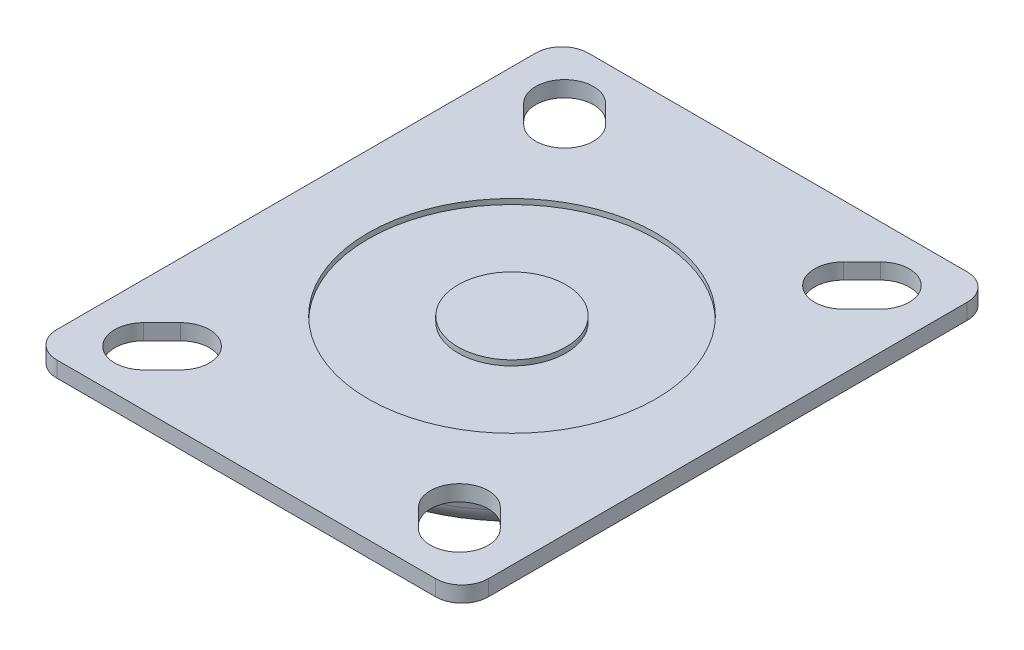
ISO-10303-21;
HEADER;
FILE_DESCRIPTION(('STEP AP214'),'2;1');
FILE_NAME('part.step','',(''),(''),'','','');
FILE_SCHEMA(('AUTOMOTIVE_DESIGN { 1 0 10303 214 1 1 1 1 }'));
ENDSEC;
DATA;
#1=APPLICATION_CONTEXT('core data for automotive mechanical design processes');
#2=APPLICATION_PROTOCOL_DEFINITION('international standard','automotive_design',2000,#1);
#3=PRODUCT_CONTEXT('',#1,'mechanical');
#4=PRODUCT('Part','Part','',(#3));
#5=PRODUCT_RELATED_PRODUCT_CATEGORY('part','',(#4));
#6=PRODUCT_DEFINITION_FORMATION('','',#4);
#7=PRODUCT_DEFINITION_CONTEXT('part definition',#1,'design');
#8=PRODUCT_DEFINITION('design','',#6,#7);
#9=PRODUCT_DEFINITION_SHAPE('','',#8);
#10=(LENGTH_UNIT() NAMED_UNIT(*) SI_UNIT(.MILLI.,.METRE.));
#11=(NAMED_UNIT(*) PLANE_ANGLE_UNIT() SI_UNIT($,.RADIAN.));
#12=(NAMED_UNIT(*) SI_UNIT($,.STERADIAN.) SOLID_ANGLE_UNIT());
#13=UNCERTAINTY_MEASURE_WITH_UNIT(LENGTH_MEASURE(1.E-05),#10,'distance_accuracy_value','');
#14=(GEOMETRIC_REPRESENTATION_CONTEXT(3) GLOBAL_UNCERTAINTY_ASSIGNED_CONTEXT((#13)) GLOBAL_UNIT_ASSIGNED_CONTEXT((#10,
#11,#12)) REPRESENTATION_CONTEXT('',''));
#15=CARTESIAN_POINT('',(0.,0.,0.));
#16=DIRECTION('',(0.,0.,1.));
#17=DIRECTION('',(1.,0.,0.));
#18=AXIS2_PLACEMENT_3D('',#15,#16,#17);
#19=CARTESIAN_POINT('',(0.,60.5,-62.8045018441136));
#20=DIRECTION('',(0.,1.,0.));
#21=DIRECTION('',(0.,0.,1.));
#22=AXIS2_PLACEMENT_3D('',#19,#20,#21);
#23=PLANE('',#22);
#24=CARTESIAN_POINT('',(0.,60.5,-35.));
#25=DIRECTION('',(0.,-1.,0.));
#26=DIRECTION('',(0.,0.,-1.));
#27=AXIS2_PLACEMENT_3D('',#24,#25,#26);
#28=CIRCLE('',#27,27.8045018441136);
#29=CARTESIAN_POINT('',(0.,60.5,-62.8045018441136));
#30=VERTEX_POINT('',#29);
#31=EDGE_CURVE('E21',#30,#30,#28,.F.);
#32=ORIENTED_EDGE('',*,*,#31,.F.);
#33=EDGE_LOOP('',(#32));
#34=FACE_BOUND('',#33,.T.);
#35=ADVANCED_FACE('F17',(#34),#23,.F.);
#36=CARTESIAN_POINT('',(0.,65.5,-35.));
#37=DIRECTION('',(0.,-1.,0.));
#38=DIRECTION('',(0.,0.,-1.));
#39=AXIS2_PLACEMENT_3D('',#36,#37,#38);
#40=TOROIDAL_SURFACE('',#39,27.8045018441136,5.);
#41=CARTESIAN_POINT('',(0.,64.6317591116653,-35.));
#42=DIRECTION('',(0.,1.,0.));
#43=DIRECTION('',(0.,0.,1.));
#44=AXIS2_PLACEMENT_3D('',#41,#42,#43);
#45=CIRCLE('',#44,32.7285406091746);
#46=CARTESIAN_POINT('',(0.,64.6317591116653,-2.27145939082539));
#47=VERTEX_POINT('',#46);
#48=EDGE_CURVE('E221',#47,#47,#45,.T.);
#49=ORIENTED_EDGE('',*,*,#48,.F.);
#50=EDGE_LOOP('',(#49));
#51=FACE_BOUND('',#50,.T.);
#52=ORIENTED_EDGE('',*,*,#31,.T.);
#53=EDGE_LOOP('',(#52));
#54=FACE_BOUND('',#53,.T.);
#55=ADVANCED_FACE('F19',(#51,#54),#40,.T.);
#56=CARTESIAN_POINT('',(-36.,73.5,-80.5));
#57=DIRECTION('',(0.,1.,0.));
#58=DIRECTION('',(0.,0.,1.));
#59=AXIS2_PLACEMENT_3D('',#56,#57,#58);
#60=PLANE('',#59);
#61=CARTESIAN_POINT('',(0.,73.5,-35.));
#62=DIRECTION('',(0.,-1.,0.));
#63=DIRECTION('',(0.,0.,-1.));
#64=AXIS2_PLACEMENT_3D('',#61,#62,#63);
#65=CIRCLE('',#64,10.25);
#66=CARTESIAN_POINT('',(0.,73.5,-45.25));
#67=VERTEX_POINT('',#66);
#68=EDGE_CURVE('E223',#67,#67,#65,.T.);
#69=ORIENTED_EDGE('',*,*,#68,.F.);
#70=EDGE_LOOP('',(#69));
#71=FACE_BOUND('',#70,.T.);
#72=ADVANCED_FACE('F318',(#71),#60,.T.);
#73=CARTESIAN_POINT('',(0.,70.5,-35.));
#74=DIRECTION('',(0.,1.,0.));
#75=DIRECTION('',(0.,0.,1.));
#76=AXIS2_PLACEMENT_3D('',#73,#74,#75);
#77=CONICAL_SURFACE('',#76,33.7632698070847,0.174532925199442);
#78=ORIENTED_EDGE('',*,*,#48,.T.);
#79=EDGE_LOOP('',(#78));
#80=FACE_BOUND('',#79,.T.);
#81=CARTESIAN_POINT('',(0.,70.5,-35.));
#82=DIRECTION('',(0.,1.,0.));
#83=DIRECTION('',(0.,0.,1.));
#84=AXIS2_PLACEMENT_3D('',#81,#82,#83);
#85=CIRCLE('',#84,33.7632698070847);
#86=CARTESIAN_POINT('',(0.,70.5,-1.23673019291531));
#87=VERTEX_POINT('',#86);
#88=EDGE_CURVE('E310',#87,#87,#85,.F.);
#89=ORIENTED_EDGE('',*,*,#88,.T.);
#90=EDGE_LOOP('',(#89));
#91=FACE_BOUND('',#90,.T.);
#92=ADVANCED_FACE('F320',(#80,#91),#77,.T.);
#93=CARTESIAN_POINT('',(0.,72.5,-35.));
#94=DIRECTION('',(0.,-1.,0.));
#95=DIRECTION('',(0.,0.,-1.));
#96=AXIS2_PLACEMENT_3D('',#93,#94,#95);
#97=CYLINDRICAL_SURFACE('',#96,10.25);
#98=ORIENTED_EDGE('',*,*,#68,.T.);
#99=EDGE_LOOP('',(#98));
#100=FACE_BOUND('',#99,.T.);
#101=CARTESIAN_POINT('',(0.,72.5,-35.));
#102=DIRECTION('',(0.,-1.,0.));
#103=DIRECTION('',(0.,0.,-1.));
#104=AXIS2_PLACEMENT_3D('',#101,#102,#103);
#105=CIRCLE('',#104,10.25);
#106=CARTESIAN_POINT('',(0.,72.5,-45.25));
#107=VERTEX_POINT('',#106);
#108=EDGE_CURVE('E186',#107,#107,#105,.T.);
#109=ORIENTED_EDGE('',*,*,#108,.F.);
#110=EDGE_LOOP('',(#109));
#111=FACE_BOUND('',#110,.T.);
#112=ADVANCED_FACE('F315',(#100,#111),#97,.T.);
#113=CARTESIAN_POINT('',(-36.,70.5,-80.5));
#114=DIRECTION('',(0.,1.,0.));
#115=DIRECTION('',(0.,0.,1.));
#116=AXIS2_PLACEMENT_3D('',#113,#114,#115);
#117=PLANE('',#116);
#118=ORIENTED_EDGE('',*,*,#88,.F.);
#119=EDGE_LOOP('',(#118));
#120=FACE_BOUND('',#119,.T.);
#121=DIRECTION('',(0.707106781186547,0.,-0.707106781186548));
#122=VECTOR('',#121,1.);
#123=CARTESIAN_POINT('',(-26.110912703474,70.5,8.88908729652604));
#124=LINE('',#123,#122);
#125=CARTESIAN_POINT('',(-26.110912703474,70.5,8.88908729652602));
#126=VERTEX_POINT('',#125);
#127=CARTESIAN_POINT('',(-22.610912703474,70.5,5.38908729652605));
#128=VERTEX_POINT('',#127);
#129=EDGE_CURVE('E276',#126,#128,#124,.T.);
#130=ORIENTED_EDGE('',*,*,#129,.T.);
#131=CARTESIAN_POINT('',(-26.5,70.5,1.50000000000003));
#132=DIRECTION('',(0.,-1.,0.));
#133=DIRECTION('',(0.,0.,-1.));
#134=AXIS2_PLACEMENT_3D('',#131,#132,#133);
#135=CIRCLE('',#134,5.50000000000004);
#136=CARTESIAN_POINT('',(-30.389087296526,70.5,-2.38908729652601));
#137=VERTEX_POINT('',#136);
#138=EDGE_CURVE('E270',#128,#137,#135,.F.);
#139=ORIENTED_EDGE('',*,*,#138,.T.);
#140=DIRECTION('',(-0.707106781186547,0.,0.707106781186548));
#141=VECTOR('',#140,1.);
#142=CARTESIAN_POINT('',(-30.389087296526,70.5,-2.38908729652604));
#143=LINE('',#142,#141);
#144=CARTESIAN_POINT('',(-33.889087296526,70.5,1.11091270347397));
#145=VERTEX_POINT('',#144);
#146=EDGE_CURVE('E690',#137,#145,#143,.T.);
#147=ORIENTED_EDGE('',*,*,#146,.T.);
#148=CARTESIAN_POINT('',(-30.,70.5,4.99999999999997));
#149=DIRECTION('',(0.,-1.,0.));
#150=DIRECTION('',(0.,0.,-1.));
#151=AXIS2_PLACEMENT_3D('',#148,#149,#150);
#152=CIRCLE('',#151,5.50000000000005);
#153=EDGE_CURVE('E273',#145,#126,#152,.F.);
#154=ORIENTED_EDGE('',*,*,#153,.T.);
#155=EDGE_LOOP('',(#130,#139,#147,#154));
#156=FACE_BOUND('',#155,.T.);
#157=CARTESIAN_POINT('',(-30.,70.5,-75.));
#158=DIRECTION('',(0.,-1.,0.));
#159=DIRECTION('',(0.,0.,-1.));
#160=AXIS2_PLACEMENT_3D('',#157,#158,#159);
#161=CIRCLE('',#160,5.50000000000001);
#162=CARTESIAN_POINT('',(-26.110912703474,70.5,-78.889087296526));
#163=VERTEX_POINT('',#162);
#164=CARTESIAN_POINT('',(-33.889087296526,70.5,-71.110912703474));
#165=VERTEX_POINT('',#164);
#166=EDGE_CURVE('E281',#163,#165,#161,.F.);
#167=ORIENTED_EDGE('',*,*,#166,.T.);
#168=DIRECTION('',(0.707106781186548,0.,0.707106781186547));
#169=VECTOR('',#168,1.);
#170=CARTESIAN_POINT('',(-33.889087296526,70.5,-71.110912703474));
#171=LINE('',#170,#169);
#172=CARTESIAN_POINT('',(-30.389087296526,70.5,-67.610912703474));
#173=VERTEX_POINT('',#172);
#174=EDGE_CURVE('E695',#165,#173,#171,.T.);
#175=ORIENTED_EDGE('',*,*,#174,.T.);
#176=CARTESIAN_POINT('',(-26.5,70.5,-71.5));
#177=DIRECTION('',(0.,-1.,0.));
#178=DIRECTION('',(0.,0.,-1.));
#179=AXIS2_PLACEMENT_3D('',#176,#177,#178);
#180=CIRCLE('',#179,5.50000000000001);
#181=CARTESIAN_POINT('',(-22.610912703474,70.5,-75.389087296526));
#182=VERTEX_POINT('',#181);
#183=EDGE_CURVE('E277',#173,#182,#180,.F.);
#184=ORIENTED_EDGE('',*,*,#183,.T.);
#185=DIRECTION('',(-0.707106781186548,0.,-0.707106781186548));
#186=VECTOR('',#185,1.);
#187=CARTESIAN_POINT('',(-22.610912703474,70.5,-75.389087296526));
#188=LINE('',#187,#186);
#189=EDGE_CURVE('E283',#182,#163,#188,.T.);
#190=ORIENTED_EDGE('',*,*,#189,.T.);
#191=EDGE_LOOP('',(#167,#175,#184,#190));
#192=FACE_BOUND('',#191,.T.);
#193=CARTESIAN_POINT('',(26.4999993552772,70.5,1.49999935527719));
#194=DIRECTION('',(0.,-1.,0.));
#195=DIRECTION('',(0.,0.,-1.));
#196=AXIS2_PLACEMENT_3D('',#193,#194,#195);
#197=CIRCLE('',#196,5.5);
#198=CARTESIAN_POINT('',(30.3890868129839,70.5,-2.38908778006808));
#199=VERTEX_POINT('',#198);
#200=CARTESIAN_POINT('',(22.6109122199319,70.5,5.38908681298387));
#201=VERTEX_POINT('',#200);
#202=EDGE_CURVE('E289',#199,#201,#197,.F.);
#203=ORIENTED_EDGE('',*,*,#202,.T.);
#204=DIRECTION('',(0.707106781186547,0.,0.707106781186548));
#205=VECTOR('',#204,1.);
#206=CARTESIAN_POINT('',(22.610912703474,70.5,5.38908729652596));
#207=LINE('',#206,#205);
#208=CARTESIAN_POINT('',(26.1109122199319,70.5,8.88908681298388));
#209=VERTEX_POINT('',#208);
#210=EDGE_CURVE('E295',#201,#209,#207,.T.);
#211=ORIENTED_EDGE('',*,*,#210,.T.);
#212=CARTESIAN_POINT('',(29.9999993552772,70.5,4.99999935527719));
#213=DIRECTION('',(0.,-1.,0.));
#214=DIRECTION('',(0.,0.,-1.));
#215=AXIS2_PLACEMENT_3D('',#212,#213,#214);
#216=CIRCLE('',#215,5.5);
#217=CARTESIAN_POINT('',(33.8890868129839,70.5,1.11091221993192));
#218=VERTEX_POINT('',#217);
#219=EDGE_CURVE('E285',#209,#218,#216,.F.);
#220=ORIENTED_EDGE('',*,*,#219,.T.);
#221=DIRECTION('',(-0.707106781186547,0.,-0.707106781186548));
#222=VECTOR('',#221,1.);
#223=CARTESIAN_POINT('',(33.889087296526,70.5,1.11091270347404));
#224=LINE('',#223,#222);
#225=EDGE_CURVE('E291',#218,#199,#224,.T.);
#226=ORIENTED_EDGE('',*,*,#225,.T.);
#227=EDGE_LOOP('',(#203,#211,#220,#226));
#228=FACE_BOUND('',#227,.T.);
#229=DIRECTION('',(0.707106781186548,0.,-0.707106781186547));
#230=VECTOR('',#229,1.);
#231=CARTESIAN_POINT('',(30.389087296526,70.5,-67.610912703474));
#232=LINE('',#231,#230);
#233=CARTESIAN_POINT('',(30.389087296526,70.5,-67.610912703474));
#234=VERTEX_POINT('',#233);
#235=CARTESIAN_POINT('',(33.889087296526,70.5,-71.110912703474));
#236=VERTEX_POINT('',#235);
#237=EDGE_CURVE('E300',#234,#236,#232,.T.);
#238=ORIENTED_EDGE('',*,*,#237,.T.);
#239=CARTESIAN_POINT('',(30.,70.5,-75.));
#240=DIRECTION('',(0.,-1.,0.));
#241=DIRECTION('',(0.,0.,-1.));
#242=AXIS2_PLACEMENT_3D('',#239,#240,#241);
#243=CIRCLE('',#242,5.49999999999996);
#244=CARTESIAN_POINT('',(26.110912703474,70.5,-78.889087296526));
#245=VERTEX_POINT('',#244);
#246=EDGE_CURVE('E293',#236,#245,#243,.F.);
#247=ORIENTED_EDGE('',*,*,#246,.T.);
#248=DIRECTION('',(-0.707106781186549,0.,0.707106781186546));
#249=VECTOR('',#248,1.);
#250=CARTESIAN_POINT('',(26.110912703474,70.5,-78.889087296526));
#251=LINE('',#250,#249);
#252=CARTESIAN_POINT('',(22.610912703474,70.5,-75.389087296526));
#253=VERTEX_POINT('',#252);
#254=EDGE_CURVE('E207',#245,#253,#251,.T.);
#255=ORIENTED_EDGE('',*,*,#254,.T.);
#256=CARTESIAN_POINT('',(26.5,70.5,-71.5));
#257=DIRECTION('',(0.,-1.,0.));
#258=DIRECTION('',(0.,0.,-1.));
#259=AXIS2_PLACEMENT_3D('',#256,#257,#258);
#260=CIRCLE('',#259,5.49999999999996);
#261=EDGE_CURVE('E297',#253,#234,#260,.F.);
#262=ORIENTED_EDGE('',*,*,#261,.T.);
#263=EDGE_LOOP('',(#238,#247,#255,#262));
#264=FACE_BOUND('',#263,.T.);
#265=CARTESIAN_POINT('',(36.,70.5,-80.5));
#266=DIRECTION('',(0.,-1.,0.));
#267=DIRECTION('',(0.,0.,-1.));
#268=AXIS2_PLACEMENT_3D('',#265,#266,#267);
#269=CIRCLE('',#268,5.00000000000002);
#270=CARTESIAN_POINT('',(41.,70.5,-80.5));
#271=VERTEX_POINT('',#270);
#272=CARTESIAN_POINT('',(36.,70.5,-85.5));
#273=VERTEX_POINT('',#272);
#274=EDGE_CURVE('E176',#271,#273,#269,.F.);
#275=ORIENTED_EDGE('',*,*,#274,.F.);
#276=DIRECTION('',(0.,0.,-1.));
#277=VECTOR('',#276,1.);
#278=CARTESIAN_POINT('',(41.,70.5,10.5));
#279=LINE('',#278,#277);
#280=CARTESIAN_POINT('',(41.,70.5,10.5));
#281=VERTEX_POINT('',#280);
#282=EDGE_CURVE('E180',#281,#271,#279,.T.);
#283=ORIENTED_EDGE('',*,*,#282,.F.);
#284=CARTESIAN_POINT('',(36.,70.5,10.5));
#285=DIRECTION('',(0.,-1.,0.));
#286=DIRECTION('',(0.,0.,-1.));
#287=AXIS2_PLACEMENT_3D('',#284,#285,#286);
#288=CIRCLE('',#287,5.00000000000001);
#289=CARTESIAN_POINT('',(36.,70.5,15.5));
#290=VERTEX_POINT('',#289);
#291=EDGE_CURVE('E203',#290,#281,#288,.F.);
#292=ORIENTED_EDGE('',*,*,#291,.F.);
#293=DIRECTION('',(1.,0.,0.));
#294=VECTOR('',#293,1.);
#295=CARTESIAN_POINT('',(-36.0000000000001,70.5,15.5));
#296=LINE('',#295,#294);
#297=CARTESIAN_POINT('',(-36.,70.5,15.5));
#298=VERTEX_POINT('',#297);
#299=EDGE_CURVE('E209',#298,#290,#296,.T.);
#300=ORIENTED_EDGE('',*,*,#299,.F.);
#301=CARTESIAN_POINT('',(-36.,70.5,10.5));
#302=DIRECTION('',(0.,-1.,0.));
#303=DIRECTION('',(0.,0.,-1.));
#304=AXIS2_PLACEMENT_3D('',#301,#302,#303);
#305=CIRCLE('',#304,5.00000000000002);
#306=CARTESIAN_POINT('',(-41.,70.5,10.5));
#307=VERTEX_POINT('',#306);
#308=EDGE_CURVE('E302',#307,#298,#305,.F.);
#309=ORIENTED_EDGE('',*,*,#308,.F.);
#310=DIRECTION('',(0.,0.,1.));
#311=VECTOR('',#310,1.);
#312=CARTESIAN_POINT('',(-41.,70.5,-80.5));
#313=LINE('',#312,#311);
#314=CARTESIAN_POINT('',(-41.,70.5,-80.5));
#315=VERTEX_POINT('',#314);
#316=EDGE_CURVE('E214',#315,#307,#313,.T.);
#317=ORIENTED_EDGE('',*,*,#316,.F.);
#318=CARTESIAN_POINT('',(-36.,70.5,-80.5));
#319=DIRECTION('',(0.,-1.,0.));
#320=DIRECTION('',(0.,0.,-1.));
#321=AXIS2_PLACEMENT_3D('',#318,#319,#320);
#322=CIRCLE('',#321,5.00000000000002);
#323=CARTESIAN_POINT('',(-36.,70.5,-85.5));
#324=VERTEX_POINT('',#323);
#325=EDGE_CURVE('E305',#324,#315,#322,.F.);
#326=ORIENTED_EDGE('',*,*,#325,.F.);
#327=DIRECTION('',(-1.,0.,0.));
#328=VECTOR('',#327,1.);
#329=CARTESIAN_POINT('',(36.,70.5,-85.5));
#330=LINE('',#329,#328);
#331=EDGE_CURVE('E183',#273,#324,#330,.T.);
#332=ORIENTED_EDGE('',*,*,#331,.F.);
#333=EDGE_LOOP('',(#275,#283,#292,#300,#309,#317,#326,#332));
#334=FACE_BOUND('',#333,.T.);
#335=ADVANCED_FACE('F178',(#120,#156,#192,#228,#264,#334),#117,.F.);
#336=CARTESIAN_POINT('',(0.,72.5,-35.));
#337=DIRECTION('',(0.,1.,0.));
#338=DIRECTION('',(0.,0.,1.));
#339=AXIS2_PLACEMENT_3D('',#336,#337,#338);
#340=PLANE('',#339);
#341=ORIENTED_EDGE('',*,*,#108,.T.);
#342=EDGE_LOOP('',(#341));
#343=FACE_BOUND('',#342,.T.);
#344=CARTESIAN_POINT('',(0.,72.5,-35.));
#345=DIRECTION('',(0.,-1.,0.));
#346=DIRECTION('',(0.,0.,-1.));
#347=AXIS2_PLACEMENT_3D('',#344,#345,#346);
#348=CIRCLE('',#347,27.3333333333333);
#349=CARTESIAN_POINT('',(0.,72.5,-62.3333333333333));
#350=VERTEX_POINT('',#349);
#351=EDGE_CURVE('E267',#350,#350,#348,.F.);
#352=ORIENTED_EDGE('',*,*,#351,.T.);
#353=EDGE_LOOP('',(#352));
#354=FACE_BOUND('',#353,.T.);
#355=ADVANCED_FACE('F433',(#343,#354),#340,.T.);
#356=CARTESIAN_POINT('',(36.,70.5,-80.5));
#357=DIRECTION('',(0.,-1.,0.));
#358=DIRECTION('',(0.,0.,-1.));
#359=AXIS2_PLACEMENT_3D('',#356,#357,#358);
#360=CYLINDRICAL_SURFACE('',#359,5.00000000000002);
#361=CARTESIAN_POINT('',(36.,73.5,-80.5));
#362=DIRECTION('',(0.,-1.,0.));
#363=DIRECTION('',(0.,0.,-1.));
#364=AXIS2_PLACEMENT_3D('',#361,#362,#363);
#365=CIRCLE('',#364,5.00000000000002);
#366=CARTESIAN_POINT('',(41.,73.5,-80.5));
#367=VERTEX_POINT('',#366);
#368=CARTESIAN_POINT('',(36.,73.5,-85.5));
#369=VERTEX_POINT('',#368);
#370=EDGE_CURVE('E192',#367,#369,#365,.F.);
#371=ORIENTED_EDGE('',*,*,#370,.F.);
#372=DIRECTION('',(0.,1.,0.));
#373=VECTOR('',#372,1.);
#374=CARTESIAN_POINT('',(41.,70.5,-80.5));
#375=LINE('',#374,#373);
#376=EDGE_CURVE('E189',#271,#367,#375,.T.);
#377=ORIENTED_EDGE('',*,*,#376,.F.);
#378=ORIENTED_EDGE('',*,*,#274,.T.);
#379=DIRECTION('',(0.,1.,0.));
#380=VECTOR('',#379,1.);
#381=CARTESIAN_POINT('',(36.,70.5,-85.5));
#382=LINE('',#381,#380);
#383=EDGE_CURVE('E220',#369,#273,#382,.F.);
#384=ORIENTED_EDGE('',*,*,#383,.F.);
#385=EDGE_LOOP('',(#371,#377,#378,#384));
#386=FACE_BOUND('',#385,.T.);
#387=ADVANCED_FACE('F190',(#386),#360,.T.);
#388=CARTESIAN_POINT('',(36.,70.5,-85.5));
#389=DIRECTION('',(0.,0.,-1.));
#390=DIRECTION('',(-1.,0.,0.));
#391=AXIS2_PLACEMENT_3D('',#388,#389,#390);
#392=PLANE('',#391);
#393=DIRECTION('',(1.,0.,0.));
#394=VECTOR('',#393,1.);
#395=CARTESIAN_POINT('',(-36.,73.5,-85.5));
#396=LINE('',#395,#394);
#397=CARTESIAN_POINT('',(-36.,73.5,-85.5));
#398=VERTEX_POINT('',#397);
#399=EDGE_CURVE('E265',#369,#398,#396,.F.);
#400=ORIENTED_EDGE('',*,*,#399,.F.);
#401=ORIENTED_EDGE('',*,*,#383,.T.);
#402=ORIENTED_EDGE('',*,*,#331,.T.);
#403=DIRECTION('',(0.,-1.,0.));
#404=VECTOR('',#403,1.);
#405=CARTESIAN_POINT('',(-36.,70.5,-85.5));
#406=LINE('',#405,#404);
#407=EDGE_CURVE('E218',#398,#324,#406,.T.);
#408=ORIENTED_EDGE('',*,*,#407,.F.);
#409=EDGE_LOOP('',(#400,#401,#402,#408));
#410=FACE_BOUND('',#409,.T.);
#411=ADVANCED_FACE('F426',(#410),#392,.T.);
#412=CARTESIAN_POINT('',(-36.,70.5,-80.5));
#413=DIRECTION('',(0.,-1.,0.));
#414=DIRECTION('',(0.,0.,-1.));
#415=AXIS2_PLACEMENT_3D('',#412,#413,#414);
#416=CYLINDRICAL_SURFACE('',#415,5.00000000000002);
#417=CARTESIAN_POINT('',(-36.,73.5,-80.5));
#418=DIRECTION('',(0.,-1.,0.));
#419=DIRECTION('',(0.,0.,-1.));
#420=AXIS2_PLACEMENT_3D('',#417,#418,#419);
#421=CIRCLE('',#420,5.00000000000002);
#422=CARTESIAN_POINT('',(-41.,73.5,-80.5));
#423=VERTEX_POINT('',#422);
#424=EDGE_CURVE('E262',#398,#423,#421,.F.);
#425=ORIENTED_EDGE('',*,*,#424,.F.);
#426=ORIENTED_EDGE('',*,*,#407,.T.);
#427=ORIENTED_EDGE('',*,*,#325,.T.);
#428=DIRECTION('',(0.,1.,0.));
#429=VECTOR('',#428,1.);
#430=CARTESIAN_POINT('',(-41.,70.5,-80.5));
#431=LINE('',#430,#429);
#432=EDGE_CURVE('E217',#423,#315,#431,.F.);
#433=ORIENTED_EDGE('',*,*,#432,.F.);
#434=EDGE_LOOP('',(#425,#426,#427,#433));
#435=FACE_BOUND('',#434,.T.);
#436=ADVANCED_FACE('F422',(#435),#416,.T.);
#437=CARTESIAN_POINT('',(-41.,70.5,-80.5));
#438=DIRECTION('',(-1.,0.,0.));
#439=DIRECTION('',(0.,0.,1.));
#440=AXIS2_PLACEMENT_3D('',#437,#438,#439);
#441=PLANE('',#440);
#442=DIRECTION('',(0.,0.,1.));
#443=VECTOR('',#442,1.);
#444=CARTESIAN_POINT('',(-41.,73.5,-80.5));
#445=LINE('',#444,#443);
#446=CARTESIAN_POINT('',(-41.,73.5,10.5));
#447=VERTEX_POINT('',#446);
#448=EDGE_CURVE('E261',#423,#447,#445,.T.);
#449=ORIENTED_EDGE('',*,*,#448,.F.);
#450=ORIENTED_EDGE('',*,*,#432,.T.);
#451=ORIENTED_EDGE('',*,*,#316,.T.);
#452=DIRECTION('',(0.,-1.,0.));
#453=VECTOR('',#452,1.);
#454=CARTESIAN_POINT('',(-41.,70.5,10.5));
#455=LINE('',#454,#453);
#456=EDGE_CURVE('E213',#447,#307,#455,.T.);
#457=ORIENTED_EDGE('',*,*,#456,.F.);
#458=EDGE_LOOP('',(#449,#450,#451,#457));
#459=FACE_BOUND('',#458,.T.);
#460=ADVANCED_FACE('F418',(#459),#441,.T.);
#461=CARTESIAN_POINT('',(-36.,70.5,10.5));
#462=DIRECTION('',(0.,-1.,0.));
#463=DIRECTION('',(0.,0.,-1.));
#464=AXIS2_PLACEMENT_3D('',#461,#462,#463);
#465=CYLINDRICAL_SURFACE('',#464,5.00000000000002);
#466=CARTESIAN_POINT('',(-36.,73.5,10.5));
#467=DIRECTION('',(0.,-1.,0.));
#468=DIRECTION('',(0.,0.,-1.));
#469=AXIS2_PLACEMENT_3D('',#466,#467,#468);
#470=CIRCLE('',#469,5.00000000000002);
#471=CARTESIAN_POINT('',(-36.,73.5,15.5));
#472=VERTEX_POINT('',#471);
#473=EDGE_CURVE('E258',#447,#472,#470,.F.);
#474=ORIENTED_EDGE('',*,*,#473,.F.);
#475=ORIENTED_EDGE('',*,*,#456,.T.);
#476=ORIENTED_EDGE('',*,*,#308,.T.);
#477=DIRECTION('',(0.,1.,0.));
#478=VECTOR('',#477,1.);
#479=CARTESIAN_POINT('',(-36.,70.5,15.5));
#480=LINE('',#479,#478);
#481=EDGE_CURVE('E212',#472,#298,#480,.F.);
#482=ORIENTED_EDGE('',*,*,#481,.F.);
#483=EDGE_LOOP('',(#474,#475,#476,#482));
#484=FACE_BOUND('',#483,.T.);
#485=ADVANCED_FACE('F414',(#484),#465,.T.);
#486=CARTESIAN_POINT('',(-36.0000000000001,70.5,15.5));
#487=DIRECTION('',(0.,0.,1.));
#488=DIRECTION('',(1.,0.,0.));
#489=AXIS2_PLACEMENT_3D('',#486,#487,#488);
#490=PLANE('',#489);
#491=DIRECTION('',(1.,0.,0.));
#492=VECTOR('',#491,1.);
#493=CARTESIAN_POINT('',(-36.,73.5,15.5));
#494=LINE('',#493,#492);
#495=CARTESIAN_POINT('',(36.,73.5,15.5));
#496=VERTEX_POINT('',#495);
#497=EDGE_CURVE('E257',#472,#496,#494,.T.);
#498=ORIENTED_EDGE('',*,*,#497,.F.);
#499=ORIENTED_EDGE('',*,*,#481,.T.);
#500=ORIENTED_EDGE('',*,*,#299,.T.);
#501=DIRECTION('',(0.,-1.,0.));
#502=VECTOR('',#501,1.);
#503=CARTESIAN_POINT('',(36.,70.5,15.5));
#504=LINE('',#503,#502);
#505=EDGE_CURVE('E200',#496,#290,#504,.T.);
#506=ORIENTED_EDGE('',*,*,#505,.F.);
#507=EDGE_LOOP('',(#498,#499,#500,#506));
#508=FACE_BOUND('',#507,.T.);
#509=ADVANCED_FACE('F410',(#508),#490,.T.);
#510=CARTESIAN_POINT('',(36.,70.5,10.5));
#511=DIRECTION('',(0.,-1.,0.));
#512=DIRECTION('',(0.,0.,-1.));
#513=AXIS2_PLACEMENT_3D('',#510,#511,#512);
#514=CYLINDRICAL_SURFACE('',#513,5.00000000000001);
#515=CARTESIAN_POINT('',(36.,73.5,10.5));
#516=DIRECTION('',(0.,-1.,0.));
#517=DIRECTION('',(0.,0.,-1.));
#518=AXIS2_PLACEMENT_3D('',#515,#516,#517);
#519=CIRCLE('',#518,5.00000000000001);
#520=CARTESIAN_POINT('',(41.,73.5,10.5));
#521=VERTEX_POINT('',#520);
#522=EDGE_CURVE('E253',#496,#521,#519,.F.);
#523=ORIENTED_EDGE('',*,*,#522,.F.);
#524=ORIENTED_EDGE('',*,*,#505,.T.);
#525=ORIENTED_EDGE('',*,*,#291,.T.);
#526=DIRECTION('',(0.,1.,0.));
#527=VECTOR('',#526,1.);
#528=CARTESIAN_POINT('',(41.,70.5,10.5));
#529=LINE('',#528,#527);
#530=EDGE_CURVE('E196',#521,#281,#529,.F.);
#531=ORIENTED_EDGE('',*,*,#530,.F.);
#532=EDGE_LOOP('',(#523,#524,#525,#531));
#533=FACE_BOUND('',#532,.T.);
#534=ADVANCED_FACE('F407',(#533),#514,.T.);
#535=CARTESIAN_POINT('',(41.,70.5,10.5));
#536=DIRECTION('',(1.,0.,0.));
#537=DIRECTION('',(0.,0.,-1.));
#538=AXIS2_PLACEMENT_3D('',#535,#536,#537);
#539=PLANE('',#538);
#540=DIRECTION('',(0.,0.,1.));
#541=VECTOR('',#540,1.);
#542=CARTESIAN_POINT('',(41.,73.5,-80.5));
#543=LINE('',#542,#541);
#544=EDGE_CURVE('E256',#521,#367,#543,.F.);
#545=ORIENTED_EDGE('',*,*,#544,.F.);
#546=ORIENTED_EDGE('',*,*,#530,.T.);
#547=ORIENTED_EDGE('',*,*,#282,.T.);
#548=ORIENTED_EDGE('',*,*,#376,.T.);
#549=EDGE_LOOP('',(#545,#546,#547,#548));
#550=FACE_BOUND('',#549,.T.);
#551=ADVANCED_FACE('F199',(#550),#539,.T.);
#552=CARTESIAN_POINT('',(30.389087296526,70.5,-67.610912703474));
#553=DIRECTION('',(0.707106781186547,0.,0.707106781186548));
#554=DIRECTION('',(0.707106781186548,0.,-0.707106781186547));
#555=AXIS2_PLACEMENT_3D('',#552,#553,#554);
#556=PLANE('',#555);
#557=ORIENTED_EDGE('',*,*,#237,.F.);
#558=DIRECTION('',(0.,-1.,0.));
#559=VECTOR('',#558,1.);
#560=CARTESIAN_POINT('',(30.389087296526,70.5,-67.610912703474));
#561=LINE('',#560,#559);
#562=CARTESIAN_POINT('',(30.389087296526,73.5,-67.610912703474));
#563=VERTEX_POINT('',#562);
#564=EDGE_CURVE('E299',#234,#563,#561,.F.);
#565=ORIENTED_EDGE('',*,*,#564,.T.);
#566=DIRECTION('',(-0.707106781186549,0.,0.707106781186546));
#567=VECTOR('',#566,1.);
#568=CARTESIAN_POINT('',(33.889087296526,73.5,-71.110912703474));
#569=LINE('',#568,#567);
#570=CARTESIAN_POINT('',(33.889087296526,73.5,-71.110912703474));
#571=VERTEX_POINT('',#570);
#572=EDGE_CURVE('E252',#571,#563,#569,.T.);
#573=ORIENTED_EDGE('',*,*,#572,.F.);
#574=DIRECTION('',(0.,-1.,0.));
#575=VECTOR('',#574,1.);
#576=CARTESIAN_POINT('',(33.889087296526,70.5,-71.110912703474));
#577=LINE('',#576,#575);
#578=EDGE_CURVE('E296',#571,#236,#577,.T.);
#579=ORIENTED_EDGE('',*,*,#578,.T.);
#580=EDGE_LOOP('',(#557,#565,#573,#579));
#581=FACE_BOUND('',#580,.T.);
#582=ADVANCED_FACE('F400',(#581),#556,.F.);
#583=CARTESIAN_POINT('',(26.5,70.5,-71.5));
#584=DIRECTION('',(0.,-1.,0.));
#585=DIRECTION('',(0.,0.,-1.));
#586=AXIS2_PLACEMENT_3D('',#583,#584,#585);
#587=CYLINDRICAL_SURFACE('',#586,5.49999999999996);
#588=ORIENTED_EDGE('',*,*,#261,.F.);
#589=DIRECTION('',(0.,1.,0.));
#590=VECTOR('',#589,1.);
#591=CARTESIAN_POINT('',(22.610912703474,70.5,-75.389087296526));
#592=LINE('',#591,#590);
#593=CARTESIAN_POINT('',(22.610912703474,73.5,-75.389087296526));
#594=VERTEX_POINT('',#593);
#595=EDGE_CURVE('E673',#253,#594,#592,.T.);
#596=ORIENTED_EDGE('',*,*,#595,.T.);
#597=CARTESIAN_POINT('',(26.5,73.5,-71.5));
#598=DIRECTION('',(0.,-1.,0.));
#599=DIRECTION('',(0.,0.,-1.));
#600=AXIS2_PLACEMENT_3D('',#597,#598,#599);
#601=CIRCLE('',#600,5.49999999999996);
#602=EDGE_CURVE('E249',#563,#594,#601,.T.);
#603=ORIENTED_EDGE('',*,*,#602,.F.);
#604=ORIENTED_EDGE('',*,*,#564,.F.);
#605=EDGE_LOOP('',(#588,#596,#603,#604));
#606=FACE_BOUND('',#605,.T.);
#607=ADVANCED_FACE('F396',(#606),#587,.F.);
#608=CARTESIAN_POINT('',(26.110912703474,70.5,-78.889087296526));
#609=DIRECTION('',(-0.707106781186546,0.,-0.707106781186549));
#610=DIRECTION('',(-0.707106781186549,0.,0.707106781186546));
#611=AXIS2_PLACEMENT_3D('',#608,#609,#610);
#612=PLANE('',#611);
#613=ORIENTED_EDGE('',*,*,#254,.F.);
#614=DIRECTION('',(0.,-1.,0.));
#615=VECTOR('',#614,1.);
#616=CARTESIAN_POINT('',(26.110912703474,70.5,-78.889087296526));
#617=LINE('',#616,#615);
#618=CARTESIAN_POINT('',(26.110912703474,73.5,-78.889087296526));
#619=VERTEX_POINT('',#618);
#620=EDGE_CURVE('E668',#245,#619,#617,.F.);
#621=ORIENTED_EDGE('',*,*,#620,.T.);
#622=DIRECTION('',(0.707106781186546,0.,-0.707106781186549));
#623=VECTOR('',#622,1.);
#624=CARTESIAN_POINT('',(22.610912703474,73.5,-75.389087296526));
#625=LINE('',#624,#623);
#626=EDGE_CURVE('E248',#594,#619,#625,.T.);
#627=ORIENTED_EDGE('',*,*,#626,.F.);
#628=ORIENTED_EDGE('',*,*,#595,.F.);
#629=EDGE_LOOP('',(#613,#621,#627,#628));
#630=FACE_BOUND('',#629,.T.);
#631=ADVANCED_FACE('F392',(#630),#612,.F.);
#632=CARTESIAN_POINT('',(30.,70.5,-75.));
#633=DIRECTION('',(0.,-1.,0.));
#634=DIRECTION('',(0.,0.,-1.));
#635=AXIS2_PLACEMENT_3D('',#632,#633,#634);
#636=CYLINDRICAL_SURFACE('',#635,5.49999999999996);
#637=ORIENTED_EDGE('',*,*,#578,.F.);
#638=CARTESIAN_POINT('',(30.,73.5,-75.));
#639=DIRECTION('',(0.,-1.,0.));
#640=DIRECTION('',(0.,0.,-1.));
#641=AXIS2_PLACEMENT_3D('',#638,#639,#640);
#642=CIRCLE('',#641,5.49999999999996);
#643=EDGE_CURVE('E246',#619,#571,#642,.T.);
#644=ORIENTED_EDGE('',*,*,#643,.F.);
#645=ORIENTED_EDGE('',*,*,#620,.F.);
#646=ORIENTED_EDGE('',*,*,#246,.F.);
#647=EDGE_LOOP('',(#637,#644,#645,#646));
#648=FACE_BOUND('',#647,.T.);
#649=ADVANCED_FACE('F388',(#648),#636,.F.);
#650=CARTESIAN_POINT('',(22.610912703474,70.5,5.38908729652596));
#651=DIRECTION('',(-0.707106781186548,0.,0.707106781186547));
#652=DIRECTION('',(0.707106781186547,0.,0.707106781186548));
#653=AXIS2_PLACEMENT_3D('',#650,#651,#652);
#654=PLANE('',#653);
#655=ORIENTED_EDGE('',*,*,#210,.F.);
#656=DIRECTION('',(0.,-1.,0.));
#657=VECTOR('',#656,1.);
#658=CARTESIAN_POINT('',(22.6109123811126,70.5,5.38908697416458));
#659=LINE('',#658,#657);
#660=CARTESIAN_POINT('',(22.6109122199319,73.5,5.38908681298386));
#661=VERTEX_POINT('',#660);
#662=EDGE_CURVE('E292',#201,#661,#659,.F.);
#663=ORIENTED_EDGE('',*,*,#662,.T.);
#664=DIRECTION('',(-0.707106781186544,0.,-0.707106781186551));
#665=VECTOR('',#664,1.);
#666=CARTESIAN_POINT('',(26.1109123811126,73.5,8.88908697416457));
#667=LINE('',#666,#665);
#668=CARTESIAN_POINT('',(26.1109122199319,73.5,8.88908681298387));
#669=VERTEX_POINT('',#668);
#670=EDGE_CURVE('E245',#669,#661,#667,.T.);
#671=ORIENTED_EDGE('',*,*,#670,.F.);
#672=DIRECTION('',(0.,-1.,0.));
#673=VECTOR('',#672,1.);
#674=CARTESIAN_POINT('',(26.1109123811126,70.5,8.88908697416458));
#675=LINE('',#674,#673);
#676=EDGE_CURVE('E288',#669,#209,#675,.T.);
#677=ORIENTED_EDGE('',*,*,#676,.T.);
#678=EDGE_LOOP('',(#655,#663,#671,#677));
#679=FACE_BOUND('',#678,.T.);
#680=ADVANCED_FACE('F384',(#679),#654,.F.);
#681=CARTESIAN_POINT('',(26.4999993552772,70.5,1.49999935527719));
#682=DIRECTION('',(0.,-1.,0.));
#683=DIRECTION('',(0.,0.,-1.));
#684=AXIS2_PLACEMENT_3D('',#681,#682,#683);
#685=CYLINDRICAL_SURFACE('',#684,5.5);
#686=DIRECTION('',(0.,1.,0.));
#687=VECTOR('',#686,1.);
#688=CARTESIAN_POINT('',(30.3890869741646,70.5,-2.38908761888737));
#689=LINE('',#688,#687);
#690=CARTESIAN_POINT('',(30.3890868129839,73.5,-2.38908778006808));
#691=VERTEX_POINT('',#690);
#692=EDGE_CURVE('E698',#199,#691,#689,.T.);
#693=ORIENTED_EDGE('',*,*,#692,.T.);
#694=CARTESIAN_POINT('',(26.4999993552772,73.5,1.49999935527719));
#695=DIRECTION('',(0.,-1.,0.));
#696=DIRECTION('',(0.,0.,-1.));
#697=AXIS2_PLACEMENT_3D('',#694,#695,#696);
#698=CIRCLE('',#697,5.5);
#699=EDGE_CURVE('E243',#661,#691,#698,.T.);
#700=ORIENTED_EDGE('',*,*,#699,.F.);
#701=ORIENTED_EDGE('',*,*,#662,.F.);
#702=ORIENTED_EDGE('',*,*,#202,.F.);
#703=EDGE_LOOP('',(#693,#700,#701,#702));
#704=FACE_BOUND('',#703,.T.);
#705=ADVANCED_FACE('F380',(#704),#685,.F.);
#706=CARTESIAN_POINT('',(33.889087296526,70.5,1.11091270347404));
#707=DIRECTION('',(0.707106781186548,0.,-0.707106781186547));
#708=DIRECTION('',(-0.707106781186547,0.,-0.707106781186548));
#709=AXIS2_PLACEMENT_3D('',#706,#707,#708);
#710=PLANE('',#709);
#711=ORIENTED_EDGE('',*,*,#225,.F.);
#712=DIRECTION('',(0.,-1.,0.));
#713=VECTOR('',#712,1.);
#714=CARTESIAN_POINT('',(33.8890869741646,70.5,1.11091238111261));
#715=LINE('',#714,#713);
#716=CARTESIAN_POINT('',(33.8890868129839,73.5,1.11091221993192));
#717=VERTEX_POINT('',#716);
#718=EDGE_CURVE('E287',#218,#717,#715,.F.);
#719=ORIENTED_EDGE('',*,*,#718,.T.);
#720=DIRECTION('',(0.707106781186547,0.,0.707106781186547));
#721=VECTOR('',#720,1.);
#722=CARTESIAN_POINT('',(30.3890869741646,73.5,-2.38908761888737));
#723=LINE('',#722,#721);
#724=EDGE_CURVE('E242',#691,#717,#723,.T.);
#725=ORIENTED_EDGE('',*,*,#724,.F.);
#726=ORIENTED_EDGE('',*,*,#692,.F.);
#727=EDGE_LOOP('',(#711,#719,#725,#726));
#728=FACE_BOUND('',#727,.T.);
#729=ADVANCED_FACE('F376',(#728),#710,.F.);
#730=CARTESIAN_POINT('',(29.9999993552772,70.5,4.99999935527719));
#731=DIRECTION('',(0.,-1.,0.));
#732=DIRECTION('',(0.,0.,-1.));
#733=AXIS2_PLACEMENT_3D('',#730,#731,#732);
#734=CYLINDRICAL_SURFACE('',#733,5.5);
#735=ORIENTED_EDGE('',*,*,#219,.F.);
#736=ORIENTED_EDGE('',*,*,#676,.F.);
#737=CARTESIAN_POINT('',(29.9999993552772,73.5,4.99999935527719));
#738=DIRECTION('',(0.,-1.,0.));
#739=DIRECTION('',(0.,0.,-1.));
#740=AXIS2_PLACEMENT_3D('',#737,#738,#739);
#741=CIRCLE('',#740,5.5);
#742=EDGE_CURVE('E239',#717,#669,#741,.T.);
#743=ORIENTED_EDGE('',*,*,#742,.F.);
#744=ORIENTED_EDGE('',*,*,#718,.F.);
#745=EDGE_LOOP('',(#735,#736,#743,#744));
#746=FACE_BOUND('',#745,.T.);
#747=ADVANCED_FACE('F372',(#746),#734,.F.);
#748=CARTESIAN_POINT('',(-33.889087296526,70.5,-71.110912703474));
#749=DIRECTION('',(-0.707106781186547,0.,0.707106781186548));
#750=DIRECTION('',(0.707106781186548,0.,0.707106781186547));
#751=AXIS2_PLACEMENT_3D('',#748,#749,#750);
#752=PLANE('',#751);
#753=ORIENTED_EDGE('',*,*,#174,.F.);
#754=DIRECTION('',(0.,-1.,0.));
#755=VECTOR('',#754,1.);
#756=CARTESIAN_POINT('',(-33.889087296526,70.5,-71.110912703474));
#757=LINE('',#756,#755);
#758=CARTESIAN_POINT('',(-33.889087296526,73.5,-71.110912703474));
#759=VERTEX_POINT('',#758);
#760=EDGE_CURVE('E284',#165,#759,#757,.F.);
#761=ORIENTED_EDGE('',*,*,#760,.T.);
#762=DIRECTION('',(-0.707106781186547,0.,-0.707106781186547));
#763=VECTOR('',#762,1.);
#764=CARTESIAN_POINT('',(-30.389087296526,73.5,-67.610912703474));
#765=LINE('',#764,#763);
#766=CARTESIAN_POINT('',(-30.389087296526,73.5,-67.610912703474));
#767=VERTEX_POINT('',#766);
#768=EDGE_CURVE('E238',#767,#759,#765,.T.);
#769=ORIENTED_EDGE('',*,*,#768,.F.);
#770=DIRECTION('',(0.,-1.,0.));
#771=VECTOR('',#770,1.);
#772=CARTESIAN_POINT('',(-30.389087296526,70.5,-67.610912703474));
#773=LINE('',#772,#771);
#774=EDGE_CURVE('E280',#767,#173,#773,.T.);
#775=ORIENTED_EDGE('',*,*,#774,.T.);
#776=EDGE_LOOP('',(#753,#761,#769,#775));
#777=FACE_BOUND('',#776,.T.);
#778=ADVANCED_FACE('F368',(#777),#752,.F.);
#779=CARTESIAN_POINT('',(-30.,70.5,-75.));
#780=DIRECTION('',(0.,-1.,0.));
#781=DIRECTION('',(0.,0.,-1.));
#782=AXIS2_PLACEMENT_3D('',#779,#780,#781);
#783=CYLINDRICAL_SURFACE('',#782,5.50000000000001);
#784=DIRECTION('',(0.,1.,0.));
#785=VECTOR('',#784,1.);
#786=CARTESIAN_POINT('',(-26.110912703474,70.5,-78.889087296526));
#787=LINE('',#786,#785);
#788=CARTESIAN_POINT('',(-26.110912703474,73.5,-78.889087296526));
#789=VERTEX_POINT('',#788);
#790=EDGE_CURVE('E694',#163,#789,#787,.T.);
#791=ORIENTED_EDGE('',*,*,#790,.T.);
#792=CARTESIAN_POINT('',(-30.,73.5,-75.));
#793=DIRECTION('',(0.,-1.,0.));
#794=DIRECTION('',(0.,0.,-1.));
#795=AXIS2_PLACEMENT_3D('',#792,#793,#794);
#796=CIRCLE('',#795,5.50000000000001);
#797=EDGE_CURVE('E236',#759,#789,#796,.T.);
#798=ORIENTED_EDGE('',*,*,#797,.F.);
#799=ORIENTED_EDGE('',*,*,#760,.F.);
#800=ORIENTED_EDGE('',*,*,#166,.F.);
#801=EDGE_LOOP('',(#791,#798,#799,#800));
#802=FACE_BOUND('',#801,.T.);
#803=ADVANCED_FACE('F364',(#802),#783,.F.);
#804=CARTESIAN_POINT('',(-22.610912703474,70.5,-75.389087296526));
#805=DIRECTION('',(0.707106781186548,0.,-0.707106781186548));
#806=DIRECTION('',(-0.707106781186548,0.,-0.707106781186548));
#807=AXIS2_PLACEMENT_3D('',#804,#805,#806);
#808=PLANE('',#807);
#809=ORIENTED_EDGE('',*,*,#189,.F.);
#810=DIRECTION('',(0.,-1.,0.));
#811=VECTOR('',#810,1.);
#812=CARTESIAN_POINT('',(-22.610912703474,70.5,-75.389087296526));
#813=LINE('',#812,#811);
#814=CARTESIAN_POINT('',(-22.610912703474,73.5,-75.389087296526));
#815=VERTEX_POINT('',#814);
#816=EDGE_CURVE('E279',#182,#815,#813,.F.);
#817=ORIENTED_EDGE('',*,*,#816,.T.);
#818=DIRECTION('',(0.707106781186547,0.,0.707106781186547));
#819=VECTOR('',#818,1.);
#820=CARTESIAN_POINT('',(-26.110912703474,73.5,-78.889087296526));
#821=LINE('',#820,#819);
#822=EDGE_CURVE('E235',#789,#815,#821,.T.);
#823=ORIENTED_EDGE('',*,*,#822,.F.);
#824=ORIENTED_EDGE('',*,*,#790,.F.);
#825=EDGE_LOOP('',(#809,#817,#823,#824));
#826=FACE_BOUND('',#825,.T.);
#827=ADVANCED_FACE('F360',(#826),#808,.F.);
#828=CARTESIAN_POINT('',(-26.5,70.5,-71.5));
#829=DIRECTION('',(0.,-1.,0.));
#830=DIRECTION('',(0.,0.,-1.));
#831=AXIS2_PLACEMENT_3D('',#828,#829,#830);
#832=CYLINDRICAL_SURFACE('',#831,5.50000000000001);
#833=ORIENTED_EDGE('',*,*,#183,.F.);
#834=ORIENTED_EDGE('',*,*,#774,.F.);
#835=CARTESIAN_POINT('',(-26.5,73.5,-71.5));
#836=DIRECTION('',(0.,-1.,0.));
#837=DIRECTION('',(0.,0.,-1.));
#838=AXIS2_PLACEMENT_3D('',#835,#836,#837);
#839=CIRCLE('',#838,5.50000000000001);
#840=EDGE_CURVE('E232',#815,#767,#839,.T.);
#841=ORIENTED_EDGE('',*,*,#840,.F.);
#842=ORIENTED_EDGE('',*,*,#816,.F.);
#843=EDGE_LOOP('',(#833,#834,#841,#842));
#844=FACE_BOUND('',#843,.T.);
#845=ADVANCED_FACE('F356',(#844),#832,.F.);
#846=CARTESIAN_POINT('',(-26.110912703474,70.5,8.88908729652604));
#847=DIRECTION('',(0.707106781186548,0.,0.707106781186547));
#848=DIRECTION('',(0.707106781186547,0.,-0.707106781186548));
#849=AXIS2_PLACEMENT_3D('',#846,#847,#848);
#850=PLANE('',#849);
#851=ORIENTED_EDGE('',*,*,#129,.F.);
#852=DIRECTION('',(0.,-1.,0.));
#853=VECTOR('',#852,1.);
#854=CARTESIAN_POINT('',(-26.110912703474,70.5,8.88908729652604));
#855=LINE('',#854,#853);
#856=CARTESIAN_POINT('',(-26.110912703474,73.5,8.88908729652602));
#857=VERTEX_POINT('',#856);
#858=EDGE_CURVE('E275',#126,#857,#855,.F.);
#859=ORIENTED_EDGE('',*,*,#858,.T.);
#860=DIRECTION('',(-0.707106781186545,0.,0.70710678118655));
#861=VECTOR('',#860,1.);
#862=CARTESIAN_POINT('',(-22.610912703474,73.5,5.38908729652603));
#863=LINE('',#862,#861);
#864=CARTESIAN_POINT('',(-22.610912703474,73.5,5.38908729652604));
#865=VERTEX_POINT('',#864);
#866=EDGE_CURVE('E231',#865,#857,#863,.T.);
#867=ORIENTED_EDGE('',*,*,#866,.F.);
#868=DIRECTION('',(0.,-1.,0.));
#869=VECTOR('',#868,1.);
#870=CARTESIAN_POINT('',(-22.610912703474,70.5,5.38908729652607));
#871=LINE('',#870,#869);
#872=EDGE_CURVE('E272',#865,#128,#871,.T.);
#873=ORIENTED_EDGE('',*,*,#872,.T.);
#874=EDGE_LOOP('',(#851,#859,#867,#873));
#875=FACE_BOUND('',#874,.T.);
#876=ADVANCED_FACE('F352',(#875),#850,.F.);
#877=CARTESIAN_POINT('',(-30.,70.5,4.99999999999997));
#878=DIRECTION('',(0.,-1.,0.));
#879=DIRECTION('',(0.,0.,-1.));
#880=AXIS2_PLACEMENT_3D('',#877,#878,#879);
#881=CYLINDRICAL_SURFACE('',#880,5.50000000000005);
#882=ORIENTED_EDGE('',*,*,#153,.F.);
#883=DIRECTION('',(0.,1.,0.));
#884=VECTOR('',#883,1.);
#885=CARTESIAN_POINT('',(-33.889087296526,70.5,1.11091270347397));
#886=LINE('',#885,#884);
#887=CARTESIAN_POINT('',(-33.889087296526,73.5,1.11091270347395));
#888=VERTEX_POINT('',#887);
#889=EDGE_CURVE('E692',#145,#888,#886,.T.);
#890=ORIENTED_EDGE('',*,*,#889,.T.);
#891=CARTESIAN_POINT('',(-30.,73.5,4.99999999999997));
#892=DIRECTION('',(0.,-1.,0.));
#893=DIRECTION('',(0.,0.,-1.));
#894=AXIS2_PLACEMENT_3D('',#891,#892,#893);
#895=CIRCLE('',#894,5.50000000000005);
#896=EDGE_CURVE('E228',#857,#888,#895,.T.);
#897=ORIENTED_EDGE('',*,*,#896,.F.);
#898=ORIENTED_EDGE('',*,*,#858,.F.);
#899=EDGE_LOOP('',(#882,#890,#897,#898));
#900=FACE_BOUND('',#899,.T.);
#901=ADVANCED_FACE('F349',(#900),#881,.F.);
#902=CARTESIAN_POINT('',(-30.389087296526,70.5,-2.38908729652604));
#903=DIRECTION('',(-0.707106781186548,0.,-0.707106781186547));
#904=DIRECTION('',(-0.707106781186547,0.,0.707106781186548));
#905=AXIS2_PLACEMENT_3D('',#902,#903,#904);
#906=PLANE('',#905);
#907=ORIENTED_EDGE('',*,*,#146,.F.);
#908=DIRECTION('',(0.,-1.,0.));
#909=VECTOR('',#908,1.);
#910=CARTESIAN_POINT('',(-30.389087296526,70.5,-2.38908729652602));
#911=LINE('',#910,#909);
#912=CARTESIAN_POINT('',(-30.389087296526,73.5,-2.38908729652602));
#913=VERTEX_POINT('',#912);
#914=EDGE_CURVE('E36',#137,#913,#911,.F.);
#915=ORIENTED_EDGE('',*,*,#914,.T.);
#916=DIRECTION('',(0.707106781186551,0.,-0.707106781186544));
#917=VECTOR('',#916,1.);
#918=CARTESIAN_POINT('',(-33.889087296526,73.5,1.11091270347395));
#919=LINE('',#918,#917);
#920=EDGE_CURVE('E227',#888,#913,#919,.T.);
#921=ORIENTED_EDGE('',*,*,#920,.F.);
#922=ORIENTED_EDGE('',*,*,#889,.F.);
#923=EDGE_LOOP('',(#907,#915,#921,#922));
#924=FACE_BOUND('',#923,.T.);
#925=ADVANCED_FACE('F345',(#924),#906,.F.);
#926=CARTESIAN_POINT('',(-26.5,70.5,1.50000000000003));
#927=DIRECTION('',(0.,-1.,0.));
#928=DIRECTION('',(0.,0.,-1.));
#929=AXIS2_PLACEMENT_3D('',#926,#927,#928);
#930=CYLINDRICAL_SURFACE('',#929,5.50000000000004);
#931=ORIENTED_EDGE('',*,*,#872,.F.);
#932=CARTESIAN_POINT('',(-26.5,73.5,1.50000000000003));
#933=DIRECTION('',(0.,-1.,0.));
#934=DIRECTION('',(0.,0.,-1.));
#935=AXIS2_PLACEMENT_3D('',#932,#933,#934);
#936=CIRCLE('',#935,5.50000000000004);
#937=EDGE_CURVE('E27',#913,#865,#936,.T.);
#938=ORIENTED_EDGE('',*,*,#937,.F.);
#939=ORIENTED_EDGE('',*,*,#914,.F.);
#940=ORIENTED_EDGE('',*,*,#138,.F.);
#941=EDGE_LOOP('',(#931,#938,#939,#940));
#942=FACE_BOUND('',#941,.T.);
#943=ADVANCED_FACE('F338',(#942),#930,.F.);
#944=CARTESIAN_POINT('',(0.,72.5,-35.));
#945=DIRECTION('',(0.,-1.,0.));
#946=DIRECTION('',(0.,0.,-1.));
#947=AXIS2_PLACEMENT_3D('',#944,#945,#946);
#948=CYLINDRICAL_SURFACE('',#947,27.3333333333333);
#949=ORIENTED_EDGE('',*,*,#351,.F.);
#950=EDGE_LOOP('',(#949));
#951=FACE_BOUND('',#950,.T.);
#952=CARTESIAN_POINT('',(0.,73.5,-35.));
#953=DIRECTION('',(0.,-1.,0.));
#954=DIRECTION('',(0.,0.,-1.));
#955=AXIS2_PLACEMENT_3D('',#952,#953,#954);
#956=CIRCLE('',#955,27.3333333333333);
#957=CARTESIAN_POINT('',(0.,73.5,-62.3333333333333));
#958=VERTEX_POINT('',#957);
#959=EDGE_CURVE('E11',#958,#958,#956,.T.);
#960=ORIENTED_EDGE('',*,*,#959,.F.);
#961=EDGE_LOOP('',(#960));
#962=FACE_BOUND('',#961,.T.);
#963=ADVANCED_FACE('F332',(#951,#962),#948,.F.);
#964=CARTESIAN_POINT('',(-36.,73.5,-80.5));
#965=DIRECTION('',(0.,1.,0.));
#966=DIRECTION('',(0.,0.,1.));
#967=AXIS2_PLACEMENT_3D('',#964,#965,#966);
#968=PLANE('',#967);
#969=ORIENTED_EDGE('',*,*,#959,.T.);
#970=EDGE_LOOP('',(#969));
#971=FACE_BOUND('',#970,.T.);
#972=ORIENTED_EDGE('',*,*,#937,.T.);
#973=ORIENTED_EDGE('',*,*,#866,.T.);
#974=ORIENTED_EDGE('',*,*,#896,.T.);
#975=ORIENTED_EDGE('',*,*,#920,.T.);
#976=EDGE_LOOP('',(#972,#973,#974,#975));
#977=FACE_BOUND('',#976,.T.);
#978=ORIENTED_EDGE('',*,*,#822,.T.);
#979=ORIENTED_EDGE('',*,*,#840,.T.);
#980=ORIENTED_EDGE('',*,*,#768,.T.);
#981=ORIENTED_EDGE('',*,*,#797,.T.);
#982=EDGE_LOOP('',(#978,#979,#980,#981));
#983=FACE_BOUND('',#982,.T.);
#984=ORIENTED_EDGE('',*,*,#724,.T.);
#985=ORIENTED_EDGE('',*,*,#742,.T.);
#986=ORIENTED_EDGE('',*,*,#670,.T.);
#987=ORIENTED_EDGE('',*,*,#699,.T.);
#988=EDGE_LOOP('',(#984,#985,#986,#987));
#989=FACE_BOUND('',#988,.T.);
#990=ORIENTED_EDGE('',*,*,#643,.T.);
#991=ORIENTED_EDGE('',*,*,#572,.T.);
#992=ORIENTED_EDGE('',*,*,#602,.T.);
#993=ORIENTED_EDGE('',*,*,#626,.T.);
#994=EDGE_LOOP('',(#990,#991,#992,#993));
#995=FACE_BOUND('',#994,.T.);
#996=ORIENTED_EDGE('',*,*,#522,.T.);
#997=ORIENTED_EDGE('',*,*,#544,.T.);
#998=ORIENTED_EDGE('',*,*,#370,.T.);
#999=ORIENTED_EDGE('',*,*,#399,.T.);
#1000=ORIENTED_EDGE('',*,*,#424,.T.);
#1001=ORIENTED_EDGE('',*,*,#448,.T.);
#1002=ORIENTED_EDGE('',*,*,#473,.T.);
#1003=ORIENTED_EDGE('',*,*,#497,.T.);
#1004=EDGE_LOOP('',(#996,#997,#998,#999,#1000,#1001,#1002,#1003));
#1005=FACE_BOUND('',#1004,.T.);
#1006=ADVANCED_FACE('F330',(#971,#977,#983,#989,#995,#1005),#968,.T.);
#1007=CLOSED_SHELL('',(#35,#55,#72,#92,#112,#335,#355,#387,#411,#436,#460,#485,#509,#534,#551,
#582,#607,#631,#649,#680,#705,#729,#747,#778,#803,#827,#845,#876,#901,#925,#943,#963,#1006));
#1008=MANIFOLD_SOLID_BREP('B1',#1007);
#1009=ADVANCED_BREP_SHAPE_REPRESENTATION('',(#18,#1008),#14);
#1010=SHAPE_DEFINITION_REPRESENTATION(#9,#1009);
ENDSEC;
END-ISO-10303-21;
